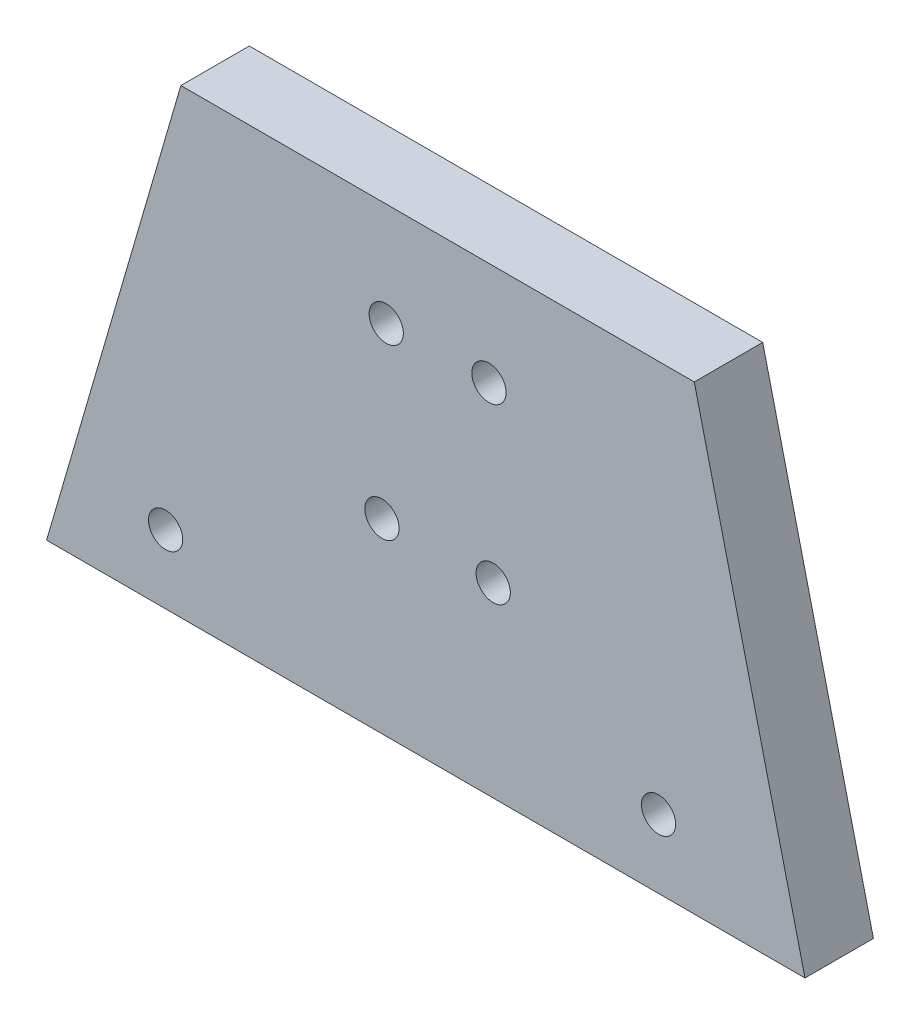
ISO-10303-21;
HEADER;
FILE_DESCRIPTION(('STEP AP214'),'2;1');
FILE_NAME('part.step','',(''),(''),'','','');
FILE_SCHEMA(('AUTOMOTIVE_DESIGN { 1 0 10303 214 1 1 1 1 }'));
ENDSEC;
DATA;
#1=APPLICATION_CONTEXT('core data for automotive mechanical design processes');
#2=APPLICATION_PROTOCOL_DEFINITION('international standard','automotive_design',2000,#1);
#3=PRODUCT_CONTEXT('',#1,'mechanical');
#4=PRODUCT('Part','Part','',(#3));
#5=PRODUCT_RELATED_PRODUCT_CATEGORY('part','',(#4));
#6=PRODUCT_DEFINITION_FORMATION('','',#4);
#7=PRODUCT_DEFINITION_CONTEXT('part definition',#1,'design');
#8=PRODUCT_DEFINITION('design','',#6,#7);
#9=PRODUCT_DEFINITION_SHAPE('','',#8);
#10=(LENGTH_UNIT() NAMED_UNIT(*) SI_UNIT(.MILLI.,.METRE.));
#11=(NAMED_UNIT(*) PLANE_ANGLE_UNIT() SI_UNIT($,.RADIAN.));
#12=(NAMED_UNIT(*) SI_UNIT($,.STERADIAN.) SOLID_ANGLE_UNIT());
#13=UNCERTAINTY_MEASURE_WITH_UNIT(LENGTH_MEASURE(1.E-05),#10,'distance_accuracy_value','');
#14=(GEOMETRIC_REPRESENTATION_CONTEXT(3) GLOBAL_UNCERTAINTY_ASSIGNED_CONTEXT((#13)) GLOBAL_UNIT_ASSIGNED_CONTEXT((#10,
#11,#12)) REPRESENTATION_CONTEXT('',''));
#15=CARTESIAN_POINT('',(0.,0.,0.));
#16=DIRECTION('',(0.,0.,1.));
#17=DIRECTION('',(1.,0.,0.));
#18=AXIS2_PLACEMENT_3D('',#15,#16,#17);
#19=CARTESIAN_POINT('',(-21.9150992368858,-20.002569933158,20.));
#20=DIRECTION('',(0.960075960819192,-0.279739431359086,0.));
#21=DIRECTION('',(0.279739431359086,0.960075960819192,0.));
#22=AXIS2_PLACEMENT_3D('',#19,#20,#21);
#23=PLANE('',#22);
#24=DIRECTION('',(-0.279739431359086,-0.960075960819192,0.));
#25=VECTOR('',#24,1.);
#26=CARTESIAN_POINT('',(-21.9150992368858,-20.002569933158,0.));
#27=LINE('',#26,#25);
#28=CARTESIAN_POINT('',(17.3193002139625,114.651324110062,0.));
#29=VERTEX_POINT('',#28);
#30=CARTESIAN_POINT('',(-21.9150992368858,-20.002569933158,0.));
#31=VERTEX_POINT('',#30);
#32=EDGE_CURVE('E248',#29,#31,#27,.T.);
#33=ORIENTED_EDGE('',*,*,#32,.T.);
#34=DIRECTION('',(0.,0.,-1.));
#35=VECTOR('',#34,1.);
#36=CARTESIAN_POINT('',(-21.9150992368858,-20.002569933158,20.));
#37=LINE('',#36,#35);
#38=CARTESIAN_POINT('',(-21.9150992368858,-20.002569933158,20.));
#39=VERTEX_POINT('',#38);
#40=EDGE_CURVE('E277',#39,#31,#37,.T.);
#41=ORIENTED_EDGE('',*,*,#40,.F.);
#42=DIRECTION('',(-0.279739431359086,-0.960075960819192,0.));
#43=VECTOR('',#42,1.);
#44=CARTESIAN_POINT('',(-21.9150992368858,-20.002569933158,20.));
#45=LINE('',#44,#43);
#46=CARTESIAN_POINT('',(17.3193002139625,114.651324110062,20.));
#47=VERTEX_POINT('',#46);
#48=EDGE_CURVE('E251',#47,#39,#45,.T.);
#49=ORIENTED_EDGE('',*,*,#48,.F.);
#50=DIRECTION('',(0.,0.,-1.));
#51=VECTOR('',#50,1.);
#52=CARTESIAN_POINT('',(17.3193002139625,114.651324110062,20.));
#53=LINE('',#52,#51);
#54=EDGE_CURVE('E261',#47,#29,#53,.T.);
#55=ORIENTED_EDGE('',*,*,#54,.T.);
#56=EDGE_LOOP('',(#33,#41,#49,#55));
#57=FACE_BOUND('',#56,.T.);
#58=ADVANCED_FACE('F39',(#57),#23,.F.);
#59=CARTESIAN_POINT('',(199.658348799587,-20.0025699331579,20.));
#60=DIRECTION('',(0.,1.,0.));
#61=DIRECTION('',(-1.,0.,0.));
#62=AXIS2_PLACEMENT_3D('',#59,#60,#61);
#63=PLANE('',#62);
#64=DIRECTION('',(1.,0.,0.));
#65=VECTOR('',#64,1.);
#66=CARTESIAN_POINT('',(199.658348799587,-20.0025699331579,0.));
#67=LINE('',#66,#65);
#68=CARTESIAN_POINT('',(199.658348799587,-20.0025699331579,0.));
#69=VERTEX_POINT('',#68);
#70=EDGE_CURVE('E264',#31,#69,#67,.T.);
#71=ORIENTED_EDGE('',*,*,#70,.T.);
#72=DIRECTION('',(0.,0.,-1.));
#73=VECTOR('',#72,1.);
#74=CARTESIAN_POINT('',(199.658348799587,-20.0025699331579,20.));
#75=LINE('',#74,#73);
#76=CARTESIAN_POINT('',(199.658348799587,-20.0025699331579,20.));
#77=VERTEX_POINT('',#76);
#78=EDGE_CURVE('E274',#77,#69,#75,.T.);
#79=ORIENTED_EDGE('',*,*,#78,.F.);
#80=DIRECTION('',(1.,0.,0.));
#81=VECTOR('',#80,1.);
#82=CARTESIAN_POINT('',(199.658348799587,-20.0025699331579,20.));
#83=LINE('',#82,#81);
#84=EDGE_CURVE('E254',#39,#77,#83,.T.);
#85=ORIENTED_EDGE('',*,*,#84,.F.);
#86=ORIENTED_EDGE('',*,*,#40,.T.);
#87=EDGE_LOOP('',(#71,#79,#85,#86));
#88=FACE_BOUND('',#87,.T.);
#89=ADVANCED_FACE('F361',(#88),#63,.F.);
#90=CARTESIAN_POINT('',(167.319300213962,114.651324110062,20.));
#91=DIRECTION('',(-0.972351052478411,-0.233523940408957,0.));
#92=DIRECTION('',(0.233523940408957,-0.972351052478411,0.));
#93=AXIS2_PLACEMENT_3D('',#90,#91,#92);
#94=PLANE('',#93);
#95=DIRECTION('',(-0.233523940408957,0.972351052478411,0.));
#96=VECTOR('',#95,1.);
#97=CARTESIAN_POINT('',(167.319300213962,114.651324110062,0.));
#98=LINE('',#97,#96);
#99=CARTESIAN_POINT('',(167.319300213962,114.651324110062,0.));
#100=VERTEX_POINT('',#99);
#101=EDGE_CURVE('E266',#69,#100,#98,.T.);
#102=ORIENTED_EDGE('',*,*,#101,.T.);
#103=DIRECTION('',(0.,0.,-1.));
#104=VECTOR('',#103,1.);
#105=CARTESIAN_POINT('',(167.319300213962,114.651324110062,20.));
#106=LINE('',#105,#104);
#107=CARTESIAN_POINT('',(167.319300213962,114.651324110062,20.));
#108=VERTEX_POINT('',#107);
#109=EDGE_CURVE('E271',#108,#100,#106,.T.);
#110=ORIENTED_EDGE('',*,*,#109,.F.);
#111=DIRECTION('',(-0.233523940408957,0.972351052478411,0.));
#112=VECTOR('',#111,1.);
#113=CARTESIAN_POINT('',(167.319300213962,114.651324110062,20.));
#114=LINE('',#113,#112);
#115=EDGE_CURVE('E257',#77,#108,#114,.T.);
#116=ORIENTED_EDGE('',*,*,#115,.F.);
#117=ORIENTED_EDGE('',*,*,#78,.T.);
#118=EDGE_LOOP('',(#102,#110,#116,#117));
#119=FACE_BOUND('',#118,.T.);
#120=ADVANCED_FACE('F358',(#119),#94,.F.);
#121=CARTESIAN_POINT('',(17.3193002139625,114.651324110062,20.));
#122=DIRECTION('',(0.,-1.,0.));
#123=DIRECTION('',(0.,0.,-1.));
#124=AXIS2_PLACEMENT_3D('',#121,#122,#123);
#125=PLANE('',#124);
#126=DIRECTION('',(-1.,0.,0.));
#127=VECTOR('',#126,1.);
#128=CARTESIAN_POINT('',(17.3193002139625,114.651324110062,0.));
#129=LINE('',#128,#127);
#130=EDGE_CURVE('E255',#100,#29,#129,.T.);
#131=ORIENTED_EDGE('',*,*,#130,.T.);
#132=ORIENTED_EDGE('',*,*,#54,.F.);
#133=DIRECTION('',(-1.,0.,0.));
#134=VECTOR('',#133,1.);
#135=CARTESIAN_POINT('',(17.3193002139625,114.651324110062,20.));
#136=LINE('',#135,#134);
#137=EDGE_CURVE('E259',#108,#47,#136,.T.);
#138=ORIENTED_EDGE('',*,*,#137,.F.);
#139=ORIENTED_EDGE('',*,*,#109,.T.);
#140=EDGE_LOOP('',(#131,#132,#138,#139));
#141=FACE_BOUND('',#140,.T.);
#142=ADVANCED_FACE('F354',(#141),#125,.F.);
#143=CARTESIAN_POINT('',(0.,0.,20.));
#144=DIRECTION('',(0.,0.,-1.));
#145=DIRECTION('',(-1.,0.,0.));
#146=AXIS2_PLACEMENT_3D('',#143,#144,#145);
#147=PLANE('',#146);
#148=CARTESIAN_POINT('',(156.886362856767,-0.00256993315796497,20.));
#149=DIRECTION('',(0.,0.,-1.));
#150=DIRECTION('',(-1.,0.,0.));
#151=AXIS2_PLACEMENT_3D('',#148,#149,#150);
#152=CIRCLE('',#151,4.99999999999999);
#153=CARTESIAN_POINT('',(151.886362856767,-0.00256993315796497,20.));
#154=VERTEX_POINT('',#153);
#155=EDGE_CURVE('E155',#154,#154,#152,.T.);
#156=ORIENTED_EDGE('',*,*,#155,.T.);
#157=EDGE_LOOP('',(#156));
#158=FACE_BOUND('',#157,.T.);
#159=CARTESIAN_POINT('',(12.8535804729409,-0.00256993315796497,20.));
#160=DIRECTION('',(0.,0.,-1.));
#161=DIRECTION('',(-1.,0.,0.));
#162=AXIS2_PLACEMENT_3D('',#159,#160,#161);
#163=CIRCLE('',#162,5.);
#164=CARTESIAN_POINT('',(7.85358047294094,-0.00256993315796497,20.));
#165=VERTEX_POINT('',#164);
#166=EDGE_CURVE('E314',#165,#165,#163,.T.);
#167=ORIENTED_EDGE('',*,*,#166,.T.);
#168=EDGE_LOOP('',(#167));
#169=FACE_BOUND('',#168,.T.);
#170=CARTESIAN_POINT('',(107.319300213962,84.4330010748442,20.));
#171=DIRECTION('',(0.,0.,1.));
#172=DIRECTION('',(-1.,0.,0.));
#173=AXIS2_PLACEMENT_3D('',#170,#171,#172);
#174=CIRCLE('',#173,4.99999999999999);
#175=CARTESIAN_POINT('',(102.319300213962,84.4330010748442,20.));
#176=VERTEX_POINT('',#175);
#177=EDGE_CURVE('E240',#176,#176,#174,.T.);
#178=ORIENTED_EDGE('',*,*,#177,.F.);
#179=EDGE_LOOP('',(#178));
#180=FACE_BOUND('',#179,.T.);
#181=CARTESIAN_POINT('',(108.569300213962,34.4486285170136,20.));
#182=DIRECTION('',(0.,0.,1.));
#183=DIRECTION('',(-1.,0.,0.));
#184=AXIS2_PLACEMENT_3D('',#181,#182,#183);
#185=CIRCLE('',#184,4.99999999999999);
#186=CARTESIAN_POINT('',(103.569300213962,34.4486285170136,20.));
#187=VERTEX_POINT('',#186);
#188=EDGE_CURVE('E234',#187,#187,#185,.T.);
#189=ORIENTED_EDGE('',*,*,#188,.F.);
#190=EDGE_LOOP('',(#189));
#191=FACE_BOUND('',#190,.T.);
#192=CARTESIAN_POINT('',(76.0693002139625,34.4486285170136,20.));
#193=DIRECTION('',(0.,0.,1.));
#194=DIRECTION('',(1.,0.,0.));
#195=AXIS2_PLACEMENT_3D('',#192,#193,#194);
#196=CIRCLE('',#195,4.99999999999999);
#197=CARTESIAN_POINT('',(81.0693002139624,34.4486285170136,20.));
#198=VERTEX_POINT('',#197);
#199=EDGE_CURVE('E227',#198,#198,#196,.T.);
#200=ORIENTED_EDGE('',*,*,#199,.F.);
#201=EDGE_LOOP('',(#200));
#202=FACE_BOUND('',#201,.T.);
#203=CARTESIAN_POINT('',(77.3193002139625,84.4330010748442,20.));
#204=DIRECTION('',(0.,0.,1.));
#205=DIRECTION('',(1.,0.,0.));
#206=AXIS2_PLACEMENT_3D('',#203,#204,#205);
#207=CIRCLE('',#206,5.00000000000001);
#208=CARTESIAN_POINT('',(82.3193002139625,84.4330010748442,20.));
#209=VERTEX_POINT('',#208);
#210=EDGE_CURVE('E230',#209,#209,#207,.T.);
#211=ORIENTED_EDGE('',*,*,#210,.F.);
#212=EDGE_LOOP('',(#211));
#213=FACE_BOUND('',#212,.T.);
#214=ORIENTED_EDGE('',*,*,#48,.T.);
#215=ORIENTED_EDGE('',*,*,#84,.T.);
#216=ORIENTED_EDGE('',*,*,#115,.T.);
#217=ORIENTED_EDGE('',*,*,#137,.T.);
#218=EDGE_LOOP('',(#214,#215,#216,#217));
#219=FACE_BOUND('',#218,.T.);
#220=ADVANCED_FACE('F331',(#158,#169,#180,#191,#202,#213,#219),#147,.F.);
#221=CARTESIAN_POINT('',(0.,0.,0.));
#222=DIRECTION('',(0.,0.,-1.));
#223=DIRECTION('',(-1.,0.,0.));
#224=AXIS2_PLACEMENT_3D('',#221,#222,#223);
#225=PLANE('',#224);
#226=CARTESIAN_POINT('',(156.886362856767,-0.00256993315796497,0.));
#227=DIRECTION('',(0.,0.,-1.));
#228=DIRECTION('',(-1.,0.,0.));
#229=AXIS2_PLACEMENT_3D('',#226,#227,#228);
#230=CIRCLE('',#229,4.99999999999999);
#231=CARTESIAN_POINT('',(151.886362856767,-0.00256993315796497,0.));
#232=VERTEX_POINT('',#231);
#233=EDGE_CURVE('E317',#232,#232,#230,.T.);
#234=ORIENTED_EDGE('',*,*,#233,.F.);
#235=EDGE_LOOP('',(#234));
#236=FACE_BOUND('',#235,.T.);
#237=CARTESIAN_POINT('',(12.8535804729409,-0.00256993315796497,0.));
#238=DIRECTION('',(0.,0.,-1.));
#239=DIRECTION('',(-1.,0.,0.));
#240=AXIS2_PLACEMENT_3D('',#237,#238,#239);
#241=CIRCLE('',#240,5.);
#242=CARTESIAN_POINT('',(7.85358047294094,-0.00256993315796497,0.));
#243=VERTEX_POINT('',#242);
#244=EDGE_CURVE('E318',#243,#243,#241,.T.);
#245=ORIENTED_EDGE('',*,*,#244,.F.);
#246=EDGE_LOOP('',(#245));
#247=FACE_BOUND('',#246,.T.);
#248=DIRECTION('',(1.,0.,0.));
#249=VECTOR('',#248,1.);
#250=CARTESIAN_POINT('',(0.,83.4201292476302,0.));
#251=LINE('',#250,#249);
#252=CARTESIAN_POINT('',(82.8362229773446,83.4201292476302,0.));
#253=VERTEX_POINT('',#252);
#254=CARTESIAN_POINT('',(94.5200482415954,83.4201292476302,0.));
#255=VERTEX_POINT('',#254);
#256=EDGE_CURVE('E11',#253,#255,#251,.T.);
#257=ORIENTED_EDGE('',*,*,#256,.F.);
#258=DIRECTION('',(0.,1.,0.));
#259=VECTOR('',#258,1.);
#260=CARTESIAN_POINT('',(82.8362229773446,0.,0.));
#261=LINE('',#260,#259);
#262=CARTESIAN_POINT('',(82.8362229773446,80.8594642560723,0.));
#263=VERTEX_POINT('',#262);
#264=EDGE_CURVE('E304',#263,#253,#261,.T.);
#265=ORIENTED_EDGE('',*,*,#264,.F.);
#266=DIRECTION('',(-1.,0.,0.));
#267=VECTOR('',#266,1.);
#268=CARTESIAN_POINT('',(0.,80.8594642560723,0.));
#269=LINE('',#268,#267);
#270=CARTESIAN_POINT('',(94.5200482415954,80.8594642560723,0.));
#271=VERTEX_POINT('',#270);
#272=EDGE_CURVE('E56',#271,#263,#269,.T.);
#273=ORIENTED_EDGE('',*,*,#272,.F.);
#274=DIRECTION('',(0.,-1.,0.));
#275=VECTOR('',#274,1.);
#276=CARTESIAN_POINT('',(94.5200482415954,0.,0.));
#277=LINE('',#276,#275);
#278=EDGE_CURVE('E46',#255,#271,#277,.T.);
#279=ORIENTED_EDGE('',*,*,#278,.F.);
#280=EDGE_LOOP('',(#257,#265,#273,#279));
#281=FACE_BOUND('',#280,.T.);
#282=DIRECTION('',(0.,1.,0.));
#283=VECTOR('',#282,1.);
#284=CARTESIAN_POINT('',(60.0828654806289,0.,0.));
#285=LINE('',#284,#283);
#286=CARTESIAN_POINT('',(60.0828654806289,-14.7172651229327,0.));
#287=VERTEX_POINT('',#286);
#288=CARTESIAN_POINT('',(60.0828654806289,-11.8013714829864,0.));
#289=VERTEX_POINT('',#288);
#290=EDGE_CURVE('E301',#287,#289,#285,.T.);
#291=ORIENTED_EDGE('',*,*,#290,.F.);
#292=DIRECTION('',(-1.,0.,0.));
#293=VECTOR('',#292,1.);
#294=CARTESIAN_POINT('',(0.,-14.7172651229327,0.));
#295=LINE('',#294,#293);
#296=CARTESIAN_POINT('',(92.687189565671,-14.7172651229327,0.));
#297=VERTEX_POINT('',#296);
#298=EDGE_CURVE('E292',#297,#287,#295,.T.);
#299=ORIENTED_EDGE('',*,*,#298,.F.);
#300=DIRECTION('',(0.,-1.,0.));
#301=VECTOR('',#300,1.);
#302=CARTESIAN_POINT('',(92.687189565671,0.,0.));
#303=LINE('',#302,#301);
#304=CARTESIAN_POINT('',(92.687189565671,-11.8013714829864,0.));
#305=VERTEX_POINT('',#304);
#306=EDGE_CURVE('E295',#305,#297,#303,.T.);
#307=ORIENTED_EDGE('',*,*,#306,.F.);
#308=DIRECTION('',(1.,0.,0.));
#309=VECTOR('',#308,1.);
#310=CARTESIAN_POINT('',(0.,-11.8013714829864,0.));
#311=LINE('',#310,#309);
#312=EDGE_CURVE('E298',#289,#305,#311,.T.);
#313=ORIENTED_EDGE('',*,*,#312,.F.);
#314=EDGE_LOOP('',(#291,#299,#307,#313));
#315=FACE_BOUND('',#314,.T.);
#316=DIRECTION('',(1.,0.,0.));
#317=VECTOR('',#316,1.);
#318=CARTESIAN_POINT('',(0.,83.4201292476302,0.));
#319=LINE('',#318,#317);
#320=CARTESIAN_POINT('',(62.5135941484949,83.4201292476302,0.));
#321=VERTEX_POINT('',#320);
#322=CARTESIAN_POINT('',(71.830113795707,83.4201292476302,0.));
#323=VERTEX_POINT('',#322);
#324=EDGE_CURVE('E289',#321,#323,#319,.T.);
#325=ORIENTED_EDGE('',*,*,#324,.F.);
#326=DIRECTION('',(0.,1.,0.));
#327=VECTOR('',#326,1.);
#328=CARTESIAN_POINT('',(62.5135941484949,0.,0.));
#329=LINE('',#328,#327);
#330=CARTESIAN_POINT('',(62.5135941484949,80.8594642560723,0.));
#331=VERTEX_POINT('',#330);
#332=EDGE_CURVE('E280',#331,#321,#329,.T.);
#333=ORIENTED_EDGE('',*,*,#332,.F.);
#334=DIRECTION('',(-1.,0.,0.));
#335=VECTOR('',#334,1.);
#336=CARTESIAN_POINT('',(0.,80.8594642560723,0.));
#337=LINE('',#336,#335);
#338=CARTESIAN_POINT('',(71.830113795707,80.8594642560723,0.));
#339=VERTEX_POINT('',#338);
#340=EDGE_CURVE('E283',#339,#331,#337,.T.);
#341=ORIENTED_EDGE('',*,*,#340,.F.);
#342=DIRECTION('',(0.,-1.,0.));
#343=VECTOR('',#342,1.);
#344=CARTESIAN_POINT('',(71.830113795707,0.,0.));
#345=LINE('',#344,#343);
#346=EDGE_CURVE('E286',#323,#339,#345,.T.);
#347=ORIENTED_EDGE('',*,*,#346,.F.);
#348=EDGE_LOOP('',(#325,#333,#341,#347));
#349=FACE_BOUND('',#348,.T.);
#350=CARTESIAN_POINT('',(107.319300213962,84.4330010748442,0.));
#351=DIRECTION('',(0.,0.,1.));
#352=DIRECTION('',(-1.,0.,0.));
#353=AXIS2_PLACEMENT_3D('',#350,#351,#352);
#354=CIRCLE('',#353,4.99999999999999);
#355=CARTESIAN_POINT('',(102.319300213962,84.4330010748442,0.));
#356=VERTEX_POINT('',#355);
#357=EDGE_CURVE('E218',#356,#356,#354,.T.);
#358=ORIENTED_EDGE('',*,*,#357,.T.);
#359=EDGE_LOOP('',(#358));
#360=FACE_BOUND('',#359,.T.);
#361=CARTESIAN_POINT('',(108.569300213962,34.4486285170136,0.));
#362=DIRECTION('',(0.,0.,1.));
#363=DIRECTION('',(-1.,0.,0.));
#364=AXIS2_PLACEMENT_3D('',#361,#362,#363);
#365=CIRCLE('',#364,4.99999999999999);
#366=CARTESIAN_POINT('',(103.569300213962,34.4486285170136,0.));
#367=VERTEX_POINT('',#366);
#368=EDGE_CURVE('E237',#367,#367,#365,.T.);
#369=ORIENTED_EDGE('',*,*,#368,.T.);
#370=EDGE_LOOP('',(#369));
#371=FACE_BOUND('',#370,.T.);
#372=CARTESIAN_POINT('',(76.0693002139625,34.4486285170136,0.));
#373=DIRECTION('',(0.,0.,1.));
#374=DIRECTION('',(1.,0.,0.));
#375=AXIS2_PLACEMENT_3D('',#372,#373,#374);
#376=CIRCLE('',#375,4.99999999999999);
#377=CARTESIAN_POINT('',(81.0693002139624,34.4486285170136,0.));
#378=VERTEX_POINT('',#377);
#379=EDGE_CURVE('E231',#378,#378,#376,.T.);
#380=ORIENTED_EDGE('',*,*,#379,.T.);
#381=EDGE_LOOP('',(#380));
#382=FACE_BOUND('',#381,.T.);
#383=CARTESIAN_POINT('',(77.3193002139625,84.4330010748442,0.));
#384=DIRECTION('',(0.,0.,1.));
#385=DIRECTION('',(1.,0.,0.));
#386=AXIS2_PLACEMENT_3D('',#383,#384,#385);
#387=CIRCLE('',#386,5.00000000000001);
#388=CARTESIAN_POINT('',(82.3193002139625,84.4330010748442,0.));
#389=VERTEX_POINT('',#388);
#390=EDGE_CURVE('E245',#389,#389,#387,.T.);
#391=ORIENTED_EDGE('',*,*,#390,.T.);
#392=EDGE_LOOP('',(#391));
#393=FACE_BOUND('',#392,.T.);
#394=ORIENTED_EDGE('',*,*,#32,.F.);
#395=ORIENTED_EDGE('',*,*,#130,.F.);
#396=ORIENTED_EDGE('',*,*,#101,.F.);
#397=ORIENTED_EDGE('',*,*,#70,.F.);
#398=EDGE_LOOP('',(#394,#395,#396,#397));
#399=FACE_BOUND('',#398,.T.);
#400=ADVANCED_FACE('F327',(#236,#247,#281,#315,#349,#360,#371,#382,#393,#399),#225,.T.);
#401=CARTESIAN_POINT('',(77.3193002139625,84.4330010748442,0.));
#402=DIRECTION('',(0.,0.,1.));
#403=DIRECTION('',(1.,0.,0.));
#404=AXIS2_PLACEMENT_3D('',#401,#402,#403);
#405=CYLINDRICAL_SURFACE('',#404,5.00000000000001);
#406=ORIENTED_EDGE('',*,*,#390,.F.);
#407=EDGE_LOOP('',(#406));
#408=FACE_BOUND('',#407,.T.);
#409=ORIENTED_EDGE('',*,*,#210,.T.);
#410=EDGE_LOOP('',(#409));
#411=FACE_BOUND('',#410,.T.);
#412=ADVANCED_FACE('F330',(#408,#411),#405,.F.);
#413=CARTESIAN_POINT('',(76.0693002139625,34.4486285170136,0.));
#414=DIRECTION('',(0.,0.,1.));
#415=DIRECTION('',(1.,0.,0.));
#416=AXIS2_PLACEMENT_3D('',#413,#414,#415);
#417=CYLINDRICAL_SURFACE('',#416,4.99999999999999);
#418=ORIENTED_EDGE('',*,*,#379,.F.);
#419=EDGE_LOOP('',(#418));
#420=FACE_BOUND('',#419,.T.);
#421=ORIENTED_EDGE('',*,*,#199,.T.);
#422=EDGE_LOOP('',(#421));
#423=FACE_BOUND('',#422,.T.);
#424=ADVANCED_FACE('F395',(#420,#423),#417,.F.);
#425=CARTESIAN_POINT('',(108.569300213962,34.4486285170136,0.));
#426=DIRECTION('',(0.,0.,1.));
#427=DIRECTION('',(1.,0.,0.));
#428=AXIS2_PLACEMENT_3D('',#425,#426,#427);
#429=CYLINDRICAL_SURFACE('',#428,4.99999999999999);
#430=ORIENTED_EDGE('',*,*,#368,.F.);
#431=EDGE_LOOP('',(#430));
#432=FACE_BOUND('',#431,.T.);
#433=ORIENTED_EDGE('',*,*,#188,.T.);
#434=EDGE_LOOP('',(#433));
#435=FACE_BOUND('',#434,.T.);
#436=ADVANCED_FACE('F404',(#432,#435),#429,.F.);
#437=CARTESIAN_POINT('',(107.319300213962,84.4330010748442,0.));
#438=DIRECTION('',(0.,0.,1.));
#439=DIRECTION('',(1.,0.,0.));
#440=AXIS2_PLACEMENT_3D('',#437,#438,#439);
#441=CYLINDRICAL_SURFACE('',#440,4.99999999999999);
#442=ORIENTED_EDGE('',*,*,#357,.F.);
#443=EDGE_LOOP('',(#442));
#444=FACE_BOUND('',#443,.T.);
#445=ORIENTED_EDGE('',*,*,#177,.T.);
#446=EDGE_LOOP('',(#445));
#447=FACE_BOUND('',#446,.T.);
#448=ADVANCED_FACE('F413',(#444,#447),#441,.F.);
#449=CARTESIAN_POINT('',(62.5135941484949,83.4201292476302,-28.));
#450=DIRECTION('',(0.,1.,0.));
#451=DIRECTION('',(0.,0.,1.));
#452=AXIS2_PLACEMENT_3D('',#449,#450,#451);
#453=PLANE('',#452);
#454=DIRECTION('',(0.,0.,1.));
#455=VECTOR('',#454,1.);
#456=CARTESIAN_POINT('',(62.5135941484949,83.4201292476302,-28.));
#457=LINE('',#456,#455);
#458=CARTESIAN_POINT('',(62.5135941484949,83.4201292476302,-28.));
#459=VERTEX_POINT('',#458);
#460=EDGE_CURVE('E214',#459,#321,#457,.T.);
#461=ORIENTED_EDGE('',*,*,#460,.T.);
#462=ORIENTED_EDGE('',*,*,#324,.T.);
#463=DIRECTION('',(0.,0.,1.));
#464=VECTOR('',#463,1.);
#465=CARTESIAN_POINT('',(71.830113795707,83.4201292476302,-28.));
#466=LINE('',#465,#464);
#467=CARTESIAN_POINT('',(71.830113795707,83.4201292476302,-28.));
#468=VERTEX_POINT('',#467);
#469=EDGE_CURVE('E215',#468,#323,#466,.T.);
#470=ORIENTED_EDGE('',*,*,#469,.F.);
#471=DIRECTION('',(-1.,0.,0.));
#472=VECTOR('',#471,1.);
#473=CARTESIAN_POINT('',(62.5135941484949,83.4201292476302,-28.));
#474=LINE('',#473,#472);
#475=EDGE_CURVE('E202',#468,#459,#474,.T.);
#476=ORIENTED_EDGE('',*,*,#475,.T.);
#477=EDGE_LOOP('',(#461,#462,#470,#476));
#478=FACE_BOUND('',#477,.T.);
#479=ADVANCED_FACE('F422',(#478),#453,.T.);
#480=CARTESIAN_POINT('',(71.830113795707,83.4201292476302,-28.));
#481=DIRECTION('',(1.,0.,0.));
#482=DIRECTION('',(0.,0.,-1.));
#483=AXIS2_PLACEMENT_3D('',#480,#481,#482);
#484=PLANE('',#483);
#485=ORIENTED_EDGE('',*,*,#469,.T.);
#486=ORIENTED_EDGE('',*,*,#346,.T.);
#487=DIRECTION('',(0.,0.,1.));
#488=VECTOR('',#487,1.);
#489=CARTESIAN_POINT('',(71.830113795707,80.8594642560723,-28.));
#490=LINE('',#489,#488);
#491=CARTESIAN_POINT('',(71.830113795707,80.8594642560723,-28.));
#492=VERTEX_POINT('',#491);
#493=EDGE_CURVE('E219',#492,#339,#490,.T.);
#494=ORIENTED_EDGE('',*,*,#493,.F.);
#495=DIRECTION('',(0.,1.,0.));
#496=VECTOR('',#495,1.);
#497=CARTESIAN_POINT('',(71.830113795707,83.4201292476302,-28.));
#498=LINE('',#497,#496);
#499=EDGE_CURVE('E211',#492,#468,#498,.T.);
#500=ORIENTED_EDGE('',*,*,#499,.T.);
#501=EDGE_LOOP('',(#485,#486,#494,#500));
#502=FACE_BOUND('',#501,.T.);
#503=ADVANCED_FACE('F431',(#502),#484,.T.);
#504=CARTESIAN_POINT('',(71.830113795707,80.8594642560723,-28.));
#505=DIRECTION('',(0.,-1.,0.));
#506=DIRECTION('',(0.,0.,-1.));
#507=AXIS2_PLACEMENT_3D('',#504,#505,#506);
#508=PLANE('',#507);
#509=ORIENTED_EDGE('',*,*,#493,.T.);
#510=ORIENTED_EDGE('',*,*,#340,.T.);
#511=DIRECTION('',(0.,0.,1.));
#512=VECTOR('',#511,1.);
#513=CARTESIAN_POINT('',(62.5135941484949,80.8594642560723,-28.));
#514=LINE('',#513,#512);
#515=CARTESIAN_POINT('',(62.5135941484949,80.8594642560723,-28.));
#516=VERTEX_POINT('',#515);
#517=EDGE_CURVE('E222',#516,#331,#514,.T.);
#518=ORIENTED_EDGE('',*,*,#517,.F.);
#519=DIRECTION('',(1.,0.,0.));
#520=VECTOR('',#519,1.);
#521=CARTESIAN_POINT('',(71.830113795707,80.8594642560723,-28.));
#522=LINE('',#521,#520);
#523=EDGE_CURVE('E208',#516,#492,#522,.T.);
#524=ORIENTED_EDGE('',*,*,#523,.T.);
#525=EDGE_LOOP('',(#509,#510,#518,#524));
#526=FACE_BOUND('',#525,.T.);
#527=ADVANCED_FACE('F440',(#526),#508,.T.);
#528=CARTESIAN_POINT('',(62.5135941484949,83.4201292476302,-28.));
#529=DIRECTION('',(-1.,0.,0.));
#530=DIRECTION('',(0.,0.,1.));
#531=AXIS2_PLACEMENT_3D('',#528,#529,#530);
#532=PLANE('',#531);
#533=ORIENTED_EDGE('',*,*,#517,.T.);
#534=ORIENTED_EDGE('',*,*,#332,.T.);
#535=ORIENTED_EDGE('',*,*,#460,.F.);
#536=DIRECTION('',(0.,-1.,0.));
#537=VECTOR('',#536,1.);
#538=CARTESIAN_POINT('',(62.5135941484949,83.4201292476302,-28.));
#539=LINE('',#538,#537);
#540=EDGE_CURVE('E205',#459,#516,#539,.T.);
#541=ORIENTED_EDGE('',*,*,#540,.T.);
#542=EDGE_LOOP('',(#533,#534,#535,#541));
#543=FACE_BOUND('',#542,.T.);
#544=ADVANCED_FACE('F449',(#543),#532,.T.);
#545=CARTESIAN_POINT('',(0.,0.,-28.));
#546=DIRECTION('',(0.,0.,-1.));
#547=DIRECTION('',(-1.,0.,0.));
#548=AXIS2_PLACEMENT_3D('',#545,#546,#547);
#549=PLANE('',#548);
#550=ORIENTED_EDGE('',*,*,#475,.F.);
#551=ORIENTED_EDGE('',*,*,#499,.F.);
#552=ORIENTED_EDGE('',*,*,#523,.F.);
#553=ORIENTED_EDGE('',*,*,#540,.F.);
#554=EDGE_LOOP('',(#550,#551,#552,#553));
#555=FACE_BOUND('',#554,.T.);
#556=ADVANCED_FACE('F458',(#555),#549,.T.);
#557=CARTESIAN_POINT('',(60.0828654806289,-11.8013714829864,-28.));
#558=DIRECTION('',(-1.,0.,0.));
#559=DIRECTION('',(0.,0.,1.));
#560=AXIS2_PLACEMENT_3D('',#557,#558,#559);
#561=PLANE('',#560);
#562=DIRECTION('',(0.,0.,1.));
#563=VECTOR('',#562,1.);
#564=CARTESIAN_POINT('',(60.0828654806289,-14.7172651229327,-28.));
#565=LINE('',#564,#563);
#566=CARTESIAN_POINT('',(60.0828654806289,-14.7172651229327,-28.));
#567=VERTEX_POINT('',#566);
#568=EDGE_CURVE('E179',#567,#287,#565,.T.);
#569=ORIENTED_EDGE('',*,*,#568,.T.);
#570=ORIENTED_EDGE('',*,*,#290,.T.);
#571=DIRECTION('',(0.,0.,1.));
#572=VECTOR('',#571,1.);
#573=CARTESIAN_POINT('',(60.0828654806289,-11.8013714829864,-28.));
#574=LINE('',#573,#572);
#575=CARTESIAN_POINT('',(60.0828654806289,-11.8013714829864,-28.));
#576=VERTEX_POINT('',#575);
#577=EDGE_CURVE('E165',#576,#289,#574,.T.);
#578=ORIENTED_EDGE('',*,*,#577,.F.);
#579=DIRECTION('',(0.,-1.,0.));
#580=VECTOR('',#579,1.);
#581=CARTESIAN_POINT('',(60.0828654806289,-11.8013714829864,-28.));
#582=LINE('',#581,#580);
#583=EDGE_CURVE('E199',#576,#567,#582,.T.);
#584=ORIENTED_EDGE('',*,*,#583,.T.);
#585=EDGE_LOOP('',(#569,#570,#578,#584));
#586=FACE_BOUND('',#585,.T.);
#587=ADVANCED_FACE('F468',(#586),#561,.T.);
#588=CARTESIAN_POINT('',(60.0828654806289,-11.8013714829864,-28.));
#589=DIRECTION('',(0.,1.,0.));
#590=DIRECTION('',(0.,0.,1.));
#591=AXIS2_PLACEMENT_3D('',#588,#589,#590);
#592=PLANE('',#591);
#593=ORIENTED_EDGE('',*,*,#577,.T.);
#594=ORIENTED_EDGE('',*,*,#312,.T.);
#595=DIRECTION('',(0.,0.,1.));
#596=VECTOR('',#595,1.);
#597=CARTESIAN_POINT('',(92.687189565671,-11.8013714829864,-28.));
#598=LINE('',#597,#596);
#599=CARTESIAN_POINT('',(92.687189565671,-11.8013714829864,-28.));
#600=VERTEX_POINT('',#599);
#601=EDGE_CURVE('E186',#600,#305,#598,.T.);
#602=ORIENTED_EDGE('',*,*,#601,.F.);
#603=DIRECTION('',(-1.,0.,0.));
#604=VECTOR('',#603,1.);
#605=CARTESIAN_POINT('',(60.0828654806289,-11.8013714829864,-28.));
#606=LINE('',#605,#604);
#607=EDGE_CURVE('E182',#600,#576,#606,.T.);
#608=ORIENTED_EDGE('',*,*,#607,.T.);
#609=EDGE_LOOP('',(#593,#594,#602,#608));
#610=FACE_BOUND('',#609,.T.);
#611=ADVANCED_FACE('F476',(#610),#592,.T.);
#612=CARTESIAN_POINT('',(92.687189565671,-11.8013714829864,-28.));
#613=DIRECTION('',(1.,0.,0.));
#614=DIRECTION('',(0.,0.,-1.));
#615=AXIS2_PLACEMENT_3D('',#612,#613,#614);
#616=PLANE('',#615);
#617=ORIENTED_EDGE('',*,*,#601,.T.);
#618=ORIENTED_EDGE('',*,*,#306,.T.);
#619=DIRECTION('',(0.,0.,1.));
#620=VECTOR('',#619,1.);
#621=CARTESIAN_POINT('',(92.687189565671,-14.7172651229327,-28.));
#622=LINE('',#621,#620);
#623=CARTESIAN_POINT('',(92.687189565671,-14.7172651229327,-28.));
#624=VERTEX_POINT('',#623);
#625=EDGE_CURVE('E183',#624,#297,#622,.T.);
#626=ORIENTED_EDGE('',*,*,#625,.F.);
#627=DIRECTION('',(0.,1.,0.));
#628=VECTOR('',#627,1.);
#629=CARTESIAN_POINT('',(92.687189565671,-11.8013714829864,-28.));
#630=LINE('',#629,#628);
#631=EDGE_CURVE('E193',#624,#600,#630,.T.);
#632=ORIENTED_EDGE('',*,*,#631,.T.);
#633=EDGE_LOOP('',(#617,#618,#626,#632));
#634=FACE_BOUND('',#633,.T.);
#635=ADVANCED_FACE('F485',(#634),#616,.T.);
#636=CARTESIAN_POINT('',(60.0828654806289,-14.7172651229327,-28.));
#637=DIRECTION('',(0.,-1.,0.));
#638=DIRECTION('',(0.,0.,-1.));
#639=AXIS2_PLACEMENT_3D('',#636,#637,#638);
#640=PLANE('',#639);
#641=ORIENTED_EDGE('',*,*,#625,.T.);
#642=ORIENTED_EDGE('',*,*,#298,.T.);
#643=ORIENTED_EDGE('',*,*,#568,.F.);
#644=DIRECTION('',(1.,0.,0.));
#645=VECTOR('',#644,1.);
#646=CARTESIAN_POINT('',(60.0828654806289,-14.7172651229327,-28.));
#647=LINE('',#646,#645);
#648=EDGE_CURVE('E196',#567,#624,#647,.T.);
#649=ORIENTED_EDGE('',*,*,#648,.T.);
#650=EDGE_LOOP('',(#641,#642,#643,#649));
#651=FACE_BOUND('',#650,.T.);
#652=ADVANCED_FACE('F494',(#651),#640,.T.);
#653=CARTESIAN_POINT('',(0.,0.,-28.));
#654=DIRECTION('',(0.,0.,1.));
#655=DIRECTION('',(1.,0.,0.));
#656=AXIS2_PLACEMENT_3D('',#653,#654,#655);
#657=PLANE('',#656);
#658=ORIENTED_EDGE('',*,*,#583,.F.);
#659=ORIENTED_EDGE('',*,*,#607,.F.);
#660=ORIENTED_EDGE('',*,*,#631,.F.);
#661=ORIENTED_EDGE('',*,*,#648,.F.);
#662=EDGE_LOOP('',(#658,#659,#660,#661));
#663=FACE_BOUND('',#662,.T.);
#664=ADVANCED_FACE('F503',(#663),#657,.F.);
#665=CARTESIAN_POINT('',(82.8362229773446,83.4201292476302,-28.));
#666=DIRECTION('',(0.,1.,0.));
#667=DIRECTION('',(0.,0.,1.));
#668=AXIS2_PLACEMENT_3D('',#665,#666,#667);
#669=PLANE('',#668);
#670=DIRECTION('',(0.,0.,1.));
#671=VECTOR('',#670,1.);
#672=CARTESIAN_POINT('',(82.8362229773446,83.4201292476302,-28.));
#673=LINE('',#672,#671);
#674=CARTESIAN_POINT('',(82.8362229773446,83.4201292476302,-28.));
#675=VERTEX_POINT('',#674);
#676=EDGE_CURVE('E171',#675,#253,#673,.T.);
#677=ORIENTED_EDGE('',*,*,#676,.T.);
#678=ORIENTED_EDGE('',*,*,#256,.T.);
#679=DIRECTION('',(0.,0.,1.));
#680=VECTOR('',#679,1.);
#681=CARTESIAN_POINT('',(94.5200482415954,83.4201292476302,-28.));
#682=LINE('',#681,#680);
#683=CARTESIAN_POINT('',(94.5200482415954,83.4201292476302,-28.));
#684=VERTEX_POINT('',#683);
#685=EDGE_CURVE('E147',#684,#255,#682,.T.);
#686=ORIENTED_EDGE('',*,*,#685,.F.);
#687=DIRECTION('',(-1.,0.,0.));
#688=VECTOR('',#687,1.);
#689=CARTESIAN_POINT('',(82.8362229773446,83.4201292476302,-28.));
#690=LINE('',#689,#688);
#691=EDGE_CURVE('E151',#684,#675,#690,.T.);
#692=ORIENTED_EDGE('',*,*,#691,.T.);
#693=EDGE_LOOP('',(#677,#678,#686,#692));
#694=FACE_BOUND('',#693,.T.);
#695=ADVANCED_FACE('F150',(#694),#669,.T.);
#696=CARTESIAN_POINT('',(94.5200482415954,83.4201292476302,-28.));
#697=DIRECTION('',(1.,0.,0.));
#698=DIRECTION('',(0.,0.,-1.));
#699=AXIS2_PLACEMENT_3D('',#696,#697,#698);
#700=PLANE('',#699);
#701=ORIENTED_EDGE('',*,*,#685,.T.);
#702=ORIENTED_EDGE('',*,*,#278,.T.);
#703=DIRECTION('',(0.,0.,1.));
#704=VECTOR('',#703,1.);
#705=CARTESIAN_POINT('',(94.5200482415954,80.8594642560723,-28.));
#706=LINE('',#705,#704);
#707=CARTESIAN_POINT('',(94.5200482415954,80.8594642560723,-28.));
#708=VERTEX_POINT('',#707);
#709=EDGE_CURVE('E154',#708,#271,#706,.T.);
#710=ORIENTED_EDGE('',*,*,#709,.F.);
#711=DIRECTION('',(0.,1.,0.));
#712=VECTOR('',#711,1.);
#713=CARTESIAN_POINT('',(94.5200482415954,83.4201292476302,-28.));
#714=LINE('',#713,#712);
#715=EDGE_CURVE('E162',#708,#684,#714,.T.);
#716=ORIENTED_EDGE('',*,*,#715,.T.);
#717=EDGE_LOOP('',(#701,#702,#710,#716));
#718=FACE_BOUND('',#717,.T.);
#719=ADVANCED_FACE('F167',(#718),#700,.T.);
#720=CARTESIAN_POINT('',(82.8362229773446,80.8594642560723,-28.));
#721=DIRECTION('',(0.,-1.,0.));
#722=DIRECTION('',(0.,0.,-1.));
#723=AXIS2_PLACEMENT_3D('',#720,#721,#722);
#724=PLANE('',#723);
#725=ORIENTED_EDGE('',*,*,#709,.T.);
#726=ORIENTED_EDGE('',*,*,#272,.T.);
#727=DIRECTION('',(0.,0.,1.));
#728=VECTOR('',#727,1.);
#729=CARTESIAN_POINT('',(82.8362229773446,80.8594642560723,-28.));
#730=LINE('',#729,#728);
#731=CARTESIAN_POINT('',(82.8362229773446,80.8594642560723,-28.));
#732=VERTEX_POINT('',#731);
#733=EDGE_CURVE('E174',#732,#263,#730,.T.);
#734=ORIENTED_EDGE('',*,*,#733,.F.);
#735=DIRECTION('',(1.,0.,0.));
#736=VECTOR('',#735,1.);
#737=CARTESIAN_POINT('',(82.8362229773446,80.8594642560723,-28.));
#738=LINE('',#737,#736);
#739=EDGE_CURVE('E170',#732,#708,#738,.T.);
#740=ORIENTED_EDGE('',*,*,#739,.T.);
#741=EDGE_LOOP('',(#725,#726,#734,#740));
#742=FACE_BOUND('',#741,.T.);
#743=ADVANCED_FACE('F308',(#742),#724,.T.);
#744=CARTESIAN_POINT('',(82.8362229773446,83.4201292476302,-28.));
#745=DIRECTION('',(-1.,0.,0.));
#746=DIRECTION('',(0.,0.,1.));
#747=AXIS2_PLACEMENT_3D('',#744,#745,#746);
#748=PLANE('',#747);
#749=ORIENTED_EDGE('',*,*,#733,.T.);
#750=ORIENTED_EDGE('',*,*,#264,.T.);
#751=ORIENTED_EDGE('',*,*,#676,.F.);
#752=DIRECTION('',(0.,-1.,0.));
#753=VECTOR('',#752,1.);
#754=CARTESIAN_POINT('',(82.8362229773446,83.4201292476302,-28.));
#755=LINE('',#754,#753);
#756=EDGE_CURVE('E164',#675,#732,#755,.T.);
#757=ORIENTED_EDGE('',*,*,#756,.T.);
#758=EDGE_LOOP('',(#749,#750,#751,#757));
#759=FACE_BOUND('',#758,.T.);
#760=ADVANCED_FACE('F534',(#759),#748,.T.);
#761=CARTESIAN_POINT('',(0.,0.,-28.));
#762=DIRECTION('',(0.,0.,-1.));
#763=DIRECTION('',(-1.,0.,0.));
#764=AXIS2_PLACEMENT_3D('',#761,#762,#763);
#765=PLANE('',#764);
#766=ORIENTED_EDGE('',*,*,#691,.F.);
#767=ORIENTED_EDGE('',*,*,#715,.F.);
#768=ORIENTED_EDGE('',*,*,#739,.F.);
#769=ORIENTED_EDGE('',*,*,#756,.F.);
#770=EDGE_LOOP('',(#766,#767,#768,#769));
#771=FACE_BOUND('',#770,.T.);
#772=ADVANCED_FACE('F160',(#771),#765,.T.);
#773=CARTESIAN_POINT('',(12.8535804729409,-0.00256993315796497,28.));
#774=DIRECTION('',(0.,0.,-1.));
#775=DIRECTION('',(-1.,0.,0.));
#776=AXIS2_PLACEMENT_3D('',#773,#774,#775);
#777=CYLINDRICAL_SURFACE('',#776,5.);
#778=ORIENTED_EDGE('',*,*,#244,.T.);
#779=EDGE_LOOP('',(#778));
#780=FACE_BOUND('',#779,.T.);
#781=ORIENTED_EDGE('',*,*,#166,.F.);
#782=EDGE_LOOP('',(#781));
#783=FACE_BOUND('',#782,.T.);
#784=ADVANCED_FACE('F548',(#780,#783),#777,.F.);
#785=CARTESIAN_POINT('',(156.886362856767,-0.00256993315796497,28.));
#786=DIRECTION('',(0.,0.,-1.));
#787=DIRECTION('',(-1.,0.,0.));
#788=AXIS2_PLACEMENT_3D('',#785,#786,#787);
#789=CYLINDRICAL_SURFACE('',#788,4.99999999999999);
#790=ORIENTED_EDGE('',*,*,#233,.T.);
#791=EDGE_LOOP('',(#790));
#792=FACE_BOUND('',#791,.T.);
#793=ORIENTED_EDGE('',*,*,#155,.F.);
#794=EDGE_LOOP('',(#793));
#795=FACE_BOUND('',#794,.T.);
#796=ADVANCED_FACE('F324',(#792,#795),#789,.F.);
#797=CLOSED_SHELL('',(#58,#89,#120,#142,#220,#400,#412,#424,#436,#448,#479,#503,#527,#544,#556,
#587,#611,#635,#652,#664,#695,#719,#743,#760,#772,#784,#796));
#798=MANIFOLD_SOLID_BREP('B2',#797);
#799=ADVANCED_BREP_SHAPE_REPRESENTATION('',(#18,#798),#14);
#800=SHAPE_DEFINITION_REPRESENTATION(#9,#799);
ENDSEC;
END-ISO-10303-21;
